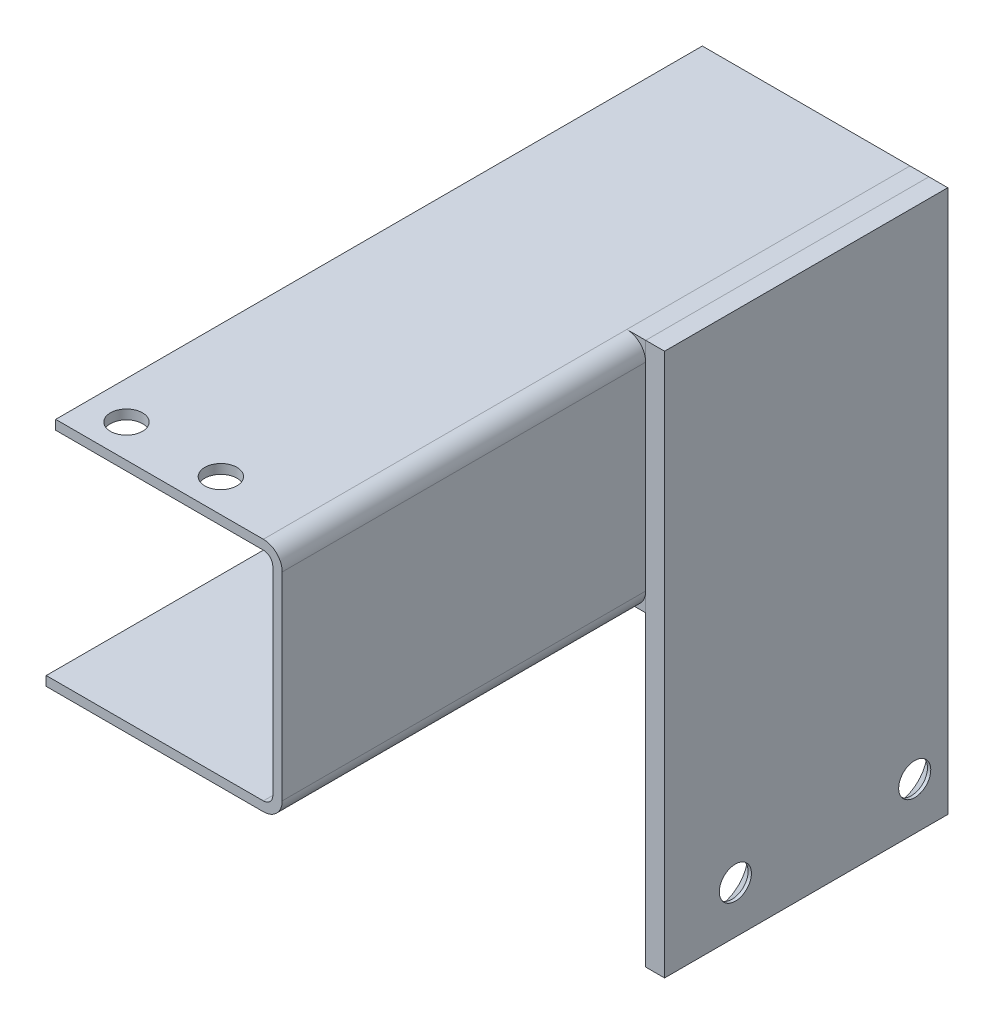
ISO-10303-21;
HEADER;
FILE_DESCRIPTION(('STEP AP214'),'2;1');
FILE_NAME('part.step','',(''),(''),'','','');
FILE_SCHEMA(('AUTOMOTIVE_DESIGN { 1 0 10303 214 1 1 1 1 }'));
ENDSEC;
DATA;
#1=APPLICATION_CONTEXT('core data for automotive mechanical design processes');
#2=APPLICATION_PROTOCOL_DEFINITION('international standard','automotive_design',2000,#1);
#3=PRODUCT_CONTEXT('',#1,'mechanical');
#4=PRODUCT('Part','Part','',(#3));
#5=PRODUCT_RELATED_PRODUCT_CATEGORY('part','',(#4));
#6=PRODUCT_DEFINITION_FORMATION('','',#4);
#7=PRODUCT_DEFINITION_CONTEXT('part definition',#1,'design');
#8=PRODUCT_DEFINITION('design','',#6,#7);
#9=PRODUCT_DEFINITION_SHAPE('','',#8);
#10=(LENGTH_UNIT() NAMED_UNIT(*) SI_UNIT(.MILLI.,.METRE.));
#11=(NAMED_UNIT(*) PLANE_ANGLE_UNIT() SI_UNIT($,.RADIAN.));
#12=(NAMED_UNIT(*) SI_UNIT($,.STERADIAN.) SOLID_ANGLE_UNIT());
#13=UNCERTAINTY_MEASURE_WITH_UNIT(LENGTH_MEASURE(1.E-05),#10,'distance_accuracy_value','');
#14=(GEOMETRIC_REPRESENTATION_CONTEXT(3) GLOBAL_UNCERTAINTY_ASSIGNED_CONTEXT((#13)) GLOBAL_UNIT_ASSIGNED_CONTEXT((#10,
#11,#12)) REPRESENTATION_CONTEXT('',''));
#15=CARTESIAN_POINT('',(0.,0.,0.));
#16=DIRECTION('',(0.,0.,1.));
#17=DIRECTION('',(1.,0.,0.));
#18=AXIS2_PLACEMENT_3D('',#15,#16,#17);
#19=CARTESIAN_POINT('',(-2.00000000000003,-12.5,-35.6715728752538));
#20=DIRECTION('',(0.,-1.,0.));
#21=DIRECTION('',(0.,0.,-1.));
#22=AXIS2_PLACEMENT_3D('',#19,#20,#21);
#23=PLANE('',#22);
#24=DIRECTION('',(1.,0.,0.));
#25=VECTOR('',#24,1.);
#26=CARTESIAN_POINT('',(-1.99999999999999,-12.5,-68.5));
#27=LINE('',#26,#25);
#28=CARTESIAN_POINT('',(0.,-12.5,-68.5));
#29=VERTEX_POINT('',#28);
#30=CARTESIAN_POINT('',(-2.00000000000001,-12.5,-68.5));
#31=VERTEX_POINT('',#30);
#32=EDGE_CURVE('P0_E47',#29,#31,#27,.F.);
#33=ORIENTED_EDGE('',*,*,#32,.F.);
#34=DIRECTION('',(0.,0.,-1.));
#35=VECTOR('',#34,1.);
#36=CARTESIAN_POINT('',(0.,-12.5,-35.6715728752538));
#37=LINE('',#36,#35);
#38=CARTESIAN_POINT('',(0.,-12.5,-38.5));
#39=VERTEX_POINT('',#38);
#40=EDGE_CURVE('P0_E54',#39,#29,#37,.T.);
#41=ORIENTED_EDGE('',*,*,#40,.F.);
#42=DIRECTION('',(1.,0.,0.));
#43=VECTOR('',#42,1.);
#44=CARTESIAN_POINT('',(2.,-12.5,-38.5));
#45=LINE('',#44,#43);
#46=CARTESIAN_POINT('',(-2.00000000000001,-12.5,-38.5));
#47=VERTEX_POINT('',#46);
#48=EDGE_CURVE('P0_E62',#39,#47,#45,.F.);
#49=ORIENTED_EDGE('',*,*,#48,.T.);
#50=DIRECTION('',(0.,0.,-1.));
#51=VECTOR('',#50,1.);
#52=CARTESIAN_POINT('',(-2.00000000000003,-12.5,-35.6715728752538));
#53=LINE('',#52,#51);
#54=EDGE_CURVE('P0_E59',#47,#31,#53,.T.);
#55=ORIENTED_EDGE('',*,*,#54,.T.);
#56=EDGE_LOOP('',(#33,#41,#49,#55));
#57=FACE_BOUND('',#56,.T.);
#58=ADVANCED_FACE('P0_F16',(#57),#23,.T.);
#59=CARTESIAN_POINT('',(-1.99999999999999,-10.5,-68.5));
#60=DIRECTION('',(0.,0.,-1.));
#61=DIRECTION('',(0.,1.,0.));
#62=AXIS2_PLACEMENT_3D('',#59,#60,#61);
#63=PLANE('',#62);
#64=DIRECTION('',(0.,1.,0.));
#65=VECTOR('',#64,1.);
#66=CARTESIAN_POINT('',(0.,-10.5,-68.5));
#67=LINE('',#66,#65);
#68=CARTESIAN_POINT('',(0.,-10.5,-68.5));
#69=VERTEX_POINT('',#68);
#70=EDGE_CURVE('P0_E50',#29,#69,#67,.T.);
#71=ORIENTED_EDGE('',*,*,#70,.F.);
#72=ORIENTED_EDGE('',*,*,#32,.T.);
#73=CARTESIAN_POINT('',(-1.99999999999999,-10.5,-68.5));
#74=DIRECTION('',(0.,0.,-1.));
#75=DIRECTION('',(0.,1.,0.));
#76=AXIS2_PLACEMENT_3D('',#73,#74,#75);
#77=CIRCLE('',#76,1.99999999999999);
#78=EDGE_CURVE('P0_E19',#31,#69,#77,.F.);
#79=ORIENTED_EDGE('',*,*,#78,.T.);
#80=EDGE_LOOP('',(#71,#72,#79));
#81=FACE_BOUND('',#80,.T.);
#82=ADVANCED_FACE('P0_F49',(#81),#63,.T.);
#83=CARTESIAN_POINT('',(0.,-10.5,-35.6715728752538));
#84=DIRECTION('',(1.,0.,0.));
#85=DIRECTION('',(0.,0.,-1.));
#86=AXIS2_PLACEMENT_3D('',#83,#84,#85);
#87=PLANE('',#86);
#88=ORIENTED_EDGE('',*,*,#70,.T.);
#89=DIRECTION('',(0.,0.,-1.));
#90=VECTOR('',#89,1.);
#91=CARTESIAN_POINT('',(0.,-10.5,-35.6715728752538));
#92=LINE('',#91,#90);
#93=CARTESIAN_POINT('',(0.,-10.5,-38.5));
#94=VERTEX_POINT('',#93);
#95=EDGE_CURVE('P0_E25',#69,#94,#92,.F.);
#96=ORIENTED_EDGE('',*,*,#95,.T.);
#97=DIRECTION('',(0.,1.,0.));
#98=VECTOR('',#97,1.);
#99=CARTESIAN_POINT('',(0.,12.5,-38.5));
#100=LINE('',#99,#98);
#101=EDGE_CURVE('P0_E31',#94,#39,#100,.F.);
#102=ORIENTED_EDGE('',*,*,#101,.T.);
#103=ORIENTED_EDGE('',*,*,#40,.T.);
#104=EDGE_LOOP('',(#88,#96,#102,#103));
#105=FACE_BOUND('',#104,.T.);
#106=ADVANCED_FACE('P0_F77',(#105),#87,.T.);
#107=CARTESIAN_POINT('',(2.,12.5,-38.5));
#108=DIRECTION('',(0.,0.,-1.));
#109=DIRECTION('',(0.,1.,0.));
#110=AXIS2_PLACEMENT_3D('',#107,#108,#109);
#111=PLANE('',#110);
#112=ORIENTED_EDGE('',*,*,#48,.F.);
#113=ORIENTED_EDGE('',*,*,#101,.F.);
#114=CARTESIAN_POINT('',(-1.99999999999999,-10.5,-38.5));
#115=DIRECTION('',(0.,0.,-1.));
#116=DIRECTION('',(0.,1.,0.));
#117=AXIS2_PLACEMENT_3D('',#114,#115,#116);
#118=CIRCLE('',#117,1.99999999999999);
#119=EDGE_CURVE('P0_E11',#94,#47,#118,.T.);
#120=ORIENTED_EDGE('',*,*,#119,.T.);
#121=EDGE_LOOP('',(#112,#113,#120));
#122=FACE_BOUND('',#121,.T.);
#123=ADVANCED_FACE('P0_F78',(#122),#111,.F.);
#124=CARTESIAN_POINT('',(-1.99999999999999,-10.5,-35.6715728752538));
#125=DIRECTION('',(0.,0.,-1.));
#126=DIRECTION('',(0.,1.,0.));
#127=AXIS2_PLACEMENT_3D('',#124,#125,#126);
#128=CYLINDRICAL_SURFACE('',#127,1.99999999999999);
#129=ORIENTED_EDGE('',*,*,#95,.F.);
#130=ORIENTED_EDGE('',*,*,#78,.F.);
#131=ORIENTED_EDGE('',*,*,#54,.F.);
#132=ORIENTED_EDGE('',*,*,#119,.F.);
#133=EDGE_LOOP('',(#129,#130,#131,#132));
#134=FACE_BOUND('',#133,.T.);
#135=ADVANCED_FACE('P0_F58',(#134),#128,.F.);
#136=CLOSED_SHELL('',(#58,#82,#106,#123,#135));
#137=MANIFOLD_SOLID_BREP('P0_B1',#136);
#138=CARTESIAN_POINT('',(-2.,10.5,-68.5));
#139=DIRECTION('',(0.,0.,-1.));
#140=DIRECTION('',(-1.,0.,0.));
#141=AXIS2_PLACEMENT_3D('',#138,#139,#140);
#142=CYLINDRICAL_SURFACE('',#141,1.);
#143=DIRECTION('',(0.,0.,1.));
#144=VECTOR('',#143,1.);
#145=CARTESIAN_POINT('',(-1.,10.5,-68.5));
#146=LINE('',#145,#144);
#147=CARTESIAN_POINT('',(-0.999999999999997,10.5,0.));
#148=VERTEX_POINT('',#147);
#149=CARTESIAN_POINT('',(-1.,10.5,-68.5));
#150=VERTEX_POINT('',#149);
#151=EDGE_CURVE('P1_E116',#148,#150,#146,.F.);
#152=ORIENTED_EDGE('',*,*,#151,.F.);
#153=CARTESIAN_POINT('',(-2.,10.5,0.));
#154=DIRECTION('',(0.,0.,-1.));
#155=DIRECTION('',(-1.,0.,0.));
#156=AXIS2_PLACEMENT_3D('',#153,#154,#155);
#157=CIRCLE('',#156,1.);
#158=CARTESIAN_POINT('',(-2.,11.5,0.));
#159=VERTEX_POINT('',#158);
#160=EDGE_CURVE('P1_E19',#159,#148,#157,.T.);
#161=ORIENTED_EDGE('',*,*,#160,.F.);
#162=DIRECTION('',(0.,0.,1.));
#163=VECTOR('',#162,1.);
#164=CARTESIAN_POINT('',(-2.,11.5,-68.5));
#165=LINE('',#164,#163);
#166=CARTESIAN_POINT('',(-2.,11.5,-68.5));
#167=VERTEX_POINT('',#166);
#168=EDGE_CURVE('P1_E175',#167,#159,#165,.T.);
#169=ORIENTED_EDGE('',*,*,#168,.F.);
#170=CARTESIAN_POINT('',(-2.,10.5,-68.5));
#171=DIRECTION('',(0.,0.,-1.));
#172=DIRECTION('',(-1.,0.,0.));
#173=AXIS2_PLACEMENT_3D('',#170,#171,#172);
#174=CIRCLE('',#173,1.);
#175=EDGE_CURVE('P1_E114',#150,#167,#174,.F.);
#176=ORIENTED_EDGE('',*,*,#175,.F.);
#177=EDGE_LOOP('',(#152,#161,#169,#176));
#178=FACE_BOUND('',#177,.T.);
#179=ADVANCED_FACE('P1_F16',(#178),#142,.F.);
#180=CARTESIAN_POINT('',(-20.,12.5,-3.5));
#181=DIRECTION('',(0.,1.,0.));
#182=DIRECTION('',(-1.,0.,0.));
#183=AXIS2_PLACEMENT_3D('',#180,#181,#182);
#184=CYLINDRICAL_SURFACE('',#183,1.7);
#185=CARTESIAN_POINT('',(-20.,12.5,-3.5));
#186=DIRECTION('',(0.,1.,0.));
#187=DIRECTION('',(-1.,0.,0.));
#188=AXIS2_PLACEMENT_3D('',#185,#186,#187);
#189=CIRCLE('',#188,1.7);
#190=CARTESIAN_POINT('',(-21.7,12.5,-3.5));
#191=VERTEX_POINT('',#190);
#192=EDGE_CURVE('P1_E169',#191,#191,#189,.F.);
#193=ORIENTED_EDGE('',*,*,#192,.F.);
#194=EDGE_LOOP('',(#193));
#195=FACE_BOUND('',#194,.T.);
#196=CARTESIAN_POINT('',(-20.,11.5,-3.5));
#197=DIRECTION('',(0.,1.,0.));
#198=DIRECTION('',(-1.,0.,0.));
#199=AXIS2_PLACEMENT_3D('',#196,#197,#198);
#200=CIRCLE('',#199,1.7);
#201=CARTESIAN_POINT('',(-21.7,11.5,-3.5));
#202=VERTEX_POINT('',#201);
#203=EDGE_CURVE('P1_E184',#202,#202,#200,.T.);
#204=ORIENTED_EDGE('',*,*,#203,.F.);
#205=EDGE_LOOP('',(#204));
#206=FACE_BOUND('',#205,.T.);
#207=ADVANCED_FACE('P1_F288',(#195,#206),#184,.F.);
#208=CARTESIAN_POINT('',(-10.,12.5,-3.5));
#209=DIRECTION('',(0.,1.,0.));
#210=DIRECTION('',(-1.,0.,0.));
#211=AXIS2_PLACEMENT_3D('',#208,#209,#210);
#212=CYLINDRICAL_SURFACE('',#211,1.7);
#213=CARTESIAN_POINT('',(-10.,12.5,-3.5));
#214=DIRECTION('',(0.,1.,0.));
#215=DIRECTION('',(-1.,0.,0.));
#216=AXIS2_PLACEMENT_3D('',#213,#214,#215);
#217=CIRCLE('',#216,1.7);
#218=CARTESIAN_POINT('',(-11.7,12.5,-3.5));
#219=VERTEX_POINT('',#218);
#220=EDGE_CURVE('P1_E161',#219,#219,#217,.F.);
#221=ORIENTED_EDGE('',*,*,#220,.F.);
#222=EDGE_LOOP('',(#221));
#223=FACE_BOUND('',#222,.T.);
#224=CARTESIAN_POINT('',(-10.,11.5,-3.5));
#225=DIRECTION('',(0.,1.,0.));
#226=DIRECTION('',(-1.,0.,0.));
#227=AXIS2_PLACEMENT_3D('',#224,#225,#226);
#228=CIRCLE('',#227,1.7);
#229=CARTESIAN_POINT('',(-11.7,11.5,-3.5));
#230=VERTEX_POINT('',#229);
#231=EDGE_CURVE('P1_E177',#230,#230,#228,.T.);
#232=ORIENTED_EDGE('',*,*,#231,.F.);
#233=EDGE_LOOP('',(#232));
#234=FACE_BOUND('',#233,.T.);
#235=ADVANCED_FACE('P1_F280',(#223,#234),#212,.F.);
#236=CARTESIAN_POINT('',(-24.,12.5,-68.5));
#237=DIRECTION('',(-1.,0.,0.));
#238=DIRECTION('',(0.,-1.,0.));
#239=AXIS2_PLACEMENT_3D('',#236,#237,#238);
#240=PLANE('',#239);
#241=DIRECTION('',(0.,-1.,0.));
#242=VECTOR('',#241,1.);
#243=CARTESIAN_POINT('',(-24.,12.5,-68.5));
#244=LINE('',#243,#242);
#245=CARTESIAN_POINT('',(-24.,12.5,-68.5));
#246=VERTEX_POINT('',#245);
#247=CARTESIAN_POINT('',(-24.,11.5,-68.5));
#248=VERTEX_POINT('',#247);
#249=EDGE_CURVE('P1_E182',#246,#248,#244,.T.);
#250=ORIENTED_EDGE('',*,*,#249,.T.);
#251=DIRECTION('',(0.,0.,1.));
#252=VECTOR('',#251,1.);
#253=CARTESIAN_POINT('',(-24.,11.5,-68.5));
#254=LINE('',#253,#252);
#255=CARTESIAN_POINT('',(-24.,11.5,0.));
#256=VERTEX_POINT('',#255);
#257=EDGE_CURVE('P1_E120',#256,#248,#254,.F.);
#258=ORIENTED_EDGE('',*,*,#257,.F.);
#259=DIRECTION('',(0.,-1.,0.));
#260=VECTOR('',#259,1.);
#261=CARTESIAN_POINT('',(-24.,12.5,0.));
#262=LINE('',#261,#260);
#263=CARTESIAN_POINT('',(-24.,12.5,0.));
#264=VERTEX_POINT('',#263);
#265=EDGE_CURVE('P1_E185',#256,#264,#262,.F.);
#266=ORIENTED_EDGE('',*,*,#265,.T.);
#267=DIRECTION('',(0.,0.,1.));
#268=VECTOR('',#267,1.);
#269=CARTESIAN_POINT('',(-24.,12.5,-68.5));
#270=LINE('',#269,#268);
#271=EDGE_CURVE('P1_E160',#246,#264,#270,.T.);
#272=ORIENTED_EDGE('',*,*,#271,.F.);
#273=EDGE_LOOP('',(#250,#258,#266,#272));
#274=FACE_BOUND('',#273,.T.);
#275=ADVANCED_FACE('P1_F272',(#274),#240,.T.);
#276=CARTESIAN_POINT('',(-24.,11.5,-68.5));
#277=DIRECTION('',(0.,-1.,0.));
#278=DIRECTION('',(1.,0.,0.));
#279=AXIS2_PLACEMENT_3D('',#276,#277,#278);
#280=PLANE('',#279);
#281=DIRECTION('',(1.,0.,0.));
#282=VECTOR('',#281,1.);
#283=CARTESIAN_POINT('',(-25.,11.5,0.));
#284=LINE('',#283,#282);
#285=EDGE_CURVE('P1_E113',#256,#159,#284,.T.);
#286=ORIENTED_EDGE('',*,*,#285,.F.);
#287=ORIENTED_EDGE('',*,*,#257,.T.);
#288=DIRECTION('',(1.,0.,0.));
#289=VECTOR('',#288,1.);
#290=CARTESIAN_POINT('',(-25.,11.5,-68.5));
#291=LINE('',#290,#289);
#292=EDGE_CURVE('P1_E201',#248,#167,#291,.T.);
#293=ORIENTED_EDGE('',*,*,#292,.T.);
#294=ORIENTED_EDGE('',*,*,#168,.T.);
#295=EDGE_LOOP('',(#286,#287,#293,#294));
#296=FACE_BOUND('',#295,.T.);
#297=ORIENTED_EDGE('',*,*,#231,.T.);
#298=EDGE_LOOP('',(#297));
#299=FACE_BOUND('',#298,.T.);
#300=ORIENTED_EDGE('',*,*,#203,.T.);
#301=EDGE_LOOP('',(#300));
#302=FACE_BOUND('',#301,.T.);
#303=ADVANCED_FACE('P1_F219',(#296,#299,#302),#280,.T.);
#304=CARTESIAN_POINT('',(-1.,11.5,-68.5));
#305=DIRECTION('',(-1.,0.,0.));
#306=DIRECTION('',(0.,-1.,0.));
#307=AXIS2_PLACEMENT_3D('',#304,#305,#306);
#308=PLANE('',#307);
#309=DIRECTION('',(0.,1.,0.));
#310=VECTOR('',#309,1.);
#311=CARTESIAN_POINT('',(-1.,-12.5,-68.5));
#312=LINE('',#311,#310);
#313=CARTESIAN_POINT('',(-1.,-10.5,-68.5));
#314=VERTEX_POINT('',#313);
#315=EDGE_CURVE('P1_E199',#150,#314,#312,.F.);
#316=ORIENTED_EDGE('',*,*,#315,.T.);
#317=DIRECTION('',(0.,0.,-1.));
#318=VECTOR('',#317,1.);
#319=CARTESIAN_POINT('',(-1.,-10.5,-68.5));
#320=LINE('',#319,#318);
#321=CARTESIAN_POINT('',(-0.999999999999998,-10.5,0.));
#322=VERTEX_POINT('',#321);
#323=EDGE_CURVE('P1_E124',#314,#322,#320,.F.);
#324=ORIENTED_EDGE('',*,*,#323,.T.);
#325=DIRECTION('',(0.,1.,0.));
#326=VECTOR('',#325,1.);
#327=CARTESIAN_POINT('',(-0.999999999999994,-12.5,0.));
#328=LINE('',#327,#326);
#329=EDGE_CURVE('P1_E110',#148,#322,#328,.F.);
#330=ORIENTED_EDGE('',*,*,#329,.F.);
#331=ORIENTED_EDGE('',*,*,#151,.T.);
#332=EDGE_LOOP('',(#316,#324,#330,#331));
#333=FACE_BOUND('',#332,.T.);
#334=ADVANCED_FACE('P1_F122',(#333),#308,.T.);
#335=CARTESIAN_POINT('',(-2.00000000000001,-10.5,-68.5));
#336=DIRECTION('',(0.,0.,1.));
#337=DIRECTION('',(1.,0.,0.));
#338=AXIS2_PLACEMENT_3D('',#335,#336,#337);
#339=CYLINDRICAL_SURFACE('',#338,2.);
#340=CARTESIAN_POINT('',(-2.00000000000001,-10.5,0.));
#341=DIRECTION('',(0.,0.,1.));
#342=DIRECTION('',(1.,0.,0.));
#343=AXIS2_PLACEMENT_3D('',#340,#341,#342);
#344=CIRCLE('',#343,2.);
#345=CARTESIAN_POINT('',(-2.00000000000001,-12.5,0.));
#346=VERTEX_POINT('',#345);
#347=CARTESIAN_POINT('',(0.,-10.5,0.));
#348=VERTEX_POINT('',#347);
#349=EDGE_CURVE('P1_E127',#346,#348,#344,.T.);
#350=ORIENTED_EDGE('',*,*,#349,.F.);
#351=DIRECTION('',(0.,0.,1.));
#352=VECTOR('',#351,1.);
#353=CARTESIAN_POINT('',(-2.00000000000001,-12.5,-68.5));
#354=LINE('',#353,#352);
#355=CARTESIAN_POINT('',(-2.00000000000001,-12.5,-68.5));
#356=VERTEX_POINT('',#355);
#357=EDGE_CURVE('P1_E144',#356,#346,#354,.T.);
#358=ORIENTED_EDGE('',*,*,#357,.F.);
#359=CARTESIAN_POINT('',(-2.00000000000001,-10.5,-68.5));
#360=DIRECTION('',(0.,0.,1.));
#361=DIRECTION('',(1.,0.,0.));
#362=AXIS2_PLACEMENT_3D('',#359,#360,#361);
#363=CIRCLE('',#362,2.);
#364=CARTESIAN_POINT('',(0.,-10.5,-68.5));
#365=VERTEX_POINT('',#364);
#366=EDGE_CURVE('P1_E194',#356,#365,#363,.T.);
#367=ORIENTED_EDGE('',*,*,#366,.T.);
#368=DIRECTION('',(0.,0.,1.));
#369=VECTOR('',#368,1.);
#370=CARTESIAN_POINT('',(0.,-10.5,-68.5));
#371=LINE('',#370,#369);
#372=EDGE_CURVE('P1_E119',#348,#365,#371,.F.);
#373=ORIENTED_EDGE('',*,*,#372,.F.);
#374=EDGE_LOOP('',(#350,#358,#367,#373));
#375=FACE_BOUND('',#374,.T.);
#376=ADVANCED_FACE('P1_F257',(#375),#339,.T.);
#377=CARTESIAN_POINT('',(0.,-12.5,-68.5));
#378=DIRECTION('',(1.,0.,0.));
#379=DIRECTION('',(0.,1.,0.));
#380=AXIS2_PLACEMENT_3D('',#377,#378,#379);
#381=PLANE('',#380);
#382=DIRECTION('',(0.,1.,0.));
#383=VECTOR('',#382,1.);
#384=CARTESIAN_POINT('',(0.,-12.5,0.));
#385=LINE('',#384,#383);
#386=CARTESIAN_POINT('',(0.,10.5,0.));
#387=VERTEX_POINT('',#386);
#388=EDGE_CURVE('P1_E141',#348,#387,#385,.T.);
#389=ORIENTED_EDGE('',*,*,#388,.F.);
#390=ORIENTED_EDGE('',*,*,#372,.T.);
#391=DIRECTION('',(0.,1.,0.));
#392=VECTOR('',#391,1.);
#393=CARTESIAN_POINT('',(0.,-12.5,-68.5));
#394=LINE('',#393,#392);
#395=CARTESIAN_POINT('',(0.,10.5,-68.5));
#396=VERTEX_POINT('',#395);
#397=EDGE_CURVE('P1_E193',#365,#396,#394,.T.);
#398=ORIENTED_EDGE('',*,*,#397,.T.);
#399=DIRECTION('',(0.,0.,1.));
#400=VECTOR('',#399,1.);
#401=CARTESIAN_POINT('',(0.,10.5,-68.5));
#402=LINE('',#401,#400);
#403=EDGE_CURVE('P1_E166',#387,#396,#402,.F.);
#404=ORIENTED_EDGE('',*,*,#403,.F.);
#405=EDGE_LOOP('',(#389,#390,#398,#404));
#406=FACE_BOUND('',#405,.T.);
#407=ADVANCED_FACE('P1_F260',(#406),#381,.T.);
#408=CARTESIAN_POINT('',(-2.,10.5,-68.5));
#409=DIRECTION('',(0.,0.,1.));
#410=DIRECTION('',(1.,0.,0.));
#411=AXIS2_PLACEMENT_3D('',#408,#409,#410);
#412=CYLINDRICAL_SURFACE('',#411,2.);
#413=CARTESIAN_POINT('',(-2.,10.5,0.));
#414=DIRECTION('',(0.,0.,1.));
#415=DIRECTION('',(1.,0.,0.));
#416=AXIS2_PLACEMENT_3D('',#413,#414,#415);
#417=CIRCLE('',#416,2.);
#418=CARTESIAN_POINT('',(-2.,12.5,0.));
#419=VERTEX_POINT('',#418);
#420=EDGE_CURVE('P1_E138',#387,#419,#417,.T.);
#421=ORIENTED_EDGE('',*,*,#420,.F.);
#422=ORIENTED_EDGE('',*,*,#403,.T.);
#423=CARTESIAN_POINT('',(-2.,10.5,-68.5));
#424=DIRECTION('',(0.,0.,1.));
#425=DIRECTION('',(1.,0.,0.));
#426=AXIS2_PLACEMENT_3D('',#423,#424,#425);
#427=CIRCLE('',#426,2.);
#428=CARTESIAN_POINT('',(-2.,12.5,-68.5));
#429=VERTEX_POINT('',#428);
#430=EDGE_CURVE('P1_E191',#396,#429,#427,.T.);
#431=ORIENTED_EDGE('',*,*,#430,.T.);
#432=DIRECTION('',(0.,0.,1.));
#433=VECTOR('',#432,1.);
#434=CARTESIAN_POINT('',(-1.99999999999999,12.5,-68.5));
#435=LINE('',#434,#433);
#436=EDGE_CURVE('P1_E157',#419,#429,#435,.F.);
#437=ORIENTED_EDGE('',*,*,#436,.F.);
#438=EDGE_LOOP('',(#421,#422,#431,#437));
#439=FACE_BOUND('',#438,.T.);
#440=ADVANCED_FACE('P1_F263',(#439),#412,.T.);
#441=CARTESIAN_POINT('',(0.,12.5,-68.5));
#442=DIRECTION('',(0.,1.,0.));
#443=DIRECTION('',(-1.,0.,0.));
#444=AXIS2_PLACEMENT_3D('',#441,#442,#443);
#445=PLANE('',#444);
#446=DIRECTION('',(1.,0.,0.));
#447=VECTOR('',#446,1.);
#448=CARTESIAN_POINT('',(-25.,12.5,-68.5));
#449=LINE('',#448,#447);
#450=EDGE_CURVE('P1_E148',#429,#246,#449,.F.);
#451=ORIENTED_EDGE('',*,*,#450,.T.);
#452=ORIENTED_EDGE('',*,*,#271,.T.);
#453=DIRECTION('',(1.,0.,0.));
#454=VECTOR('',#453,1.);
#455=CARTESIAN_POINT('',(-25.,12.5,0.));
#456=LINE('',#455,#454);
#457=EDGE_CURVE('P1_E129',#419,#264,#456,.F.);
#458=ORIENTED_EDGE('',*,*,#457,.F.);
#459=ORIENTED_EDGE('',*,*,#436,.T.);
#460=EDGE_LOOP('',(#451,#452,#458,#459));
#461=FACE_BOUND('',#460,.T.);
#462=ORIENTED_EDGE('',*,*,#220,.T.);
#463=EDGE_LOOP('',(#462));
#464=FACE_BOUND('',#463,.T.);
#465=ORIENTED_EDGE('',*,*,#192,.T.);
#466=EDGE_LOOP('',(#465));
#467=FACE_BOUND('',#466,.T.);
#468=ADVANCED_FACE('P1_F267',(#461,#464,#467),#445,.T.);
#469=CARTESIAN_POINT('',(-25.,-12.5,-68.5));
#470=DIRECTION('',(0.,-1.,0.));
#471=DIRECTION('',(1.,0.,0.));
#472=AXIS2_PLACEMENT_3D('',#469,#470,#471);
#473=PLANE('',#472);
#474=DIRECTION('',(1.,0.,0.));
#475=VECTOR('',#474,1.);
#476=CARTESIAN_POINT('',(-25.,-12.5,0.));
#477=LINE('',#476,#475);
#478=CARTESIAN_POINT('',(-25.,-12.5,0.));
#479=VERTEX_POINT('',#478);
#480=EDGE_CURVE('P1_E125',#479,#346,#477,.T.);
#481=ORIENTED_EDGE('',*,*,#480,.F.);
#482=DIRECTION('',(0.,0.,1.));
#483=VECTOR('',#482,1.);
#484=CARTESIAN_POINT('',(-25.,-12.5,-68.5));
#485=LINE('',#484,#483);
#486=CARTESIAN_POINT('',(-25.,-12.5,-68.5));
#487=VERTEX_POINT('',#486);
#488=EDGE_CURVE('P1_E151',#487,#479,#485,.T.);
#489=ORIENTED_EDGE('',*,*,#488,.F.);
#490=DIRECTION('',(1.,0.,0.));
#491=VECTOR('',#490,1.);
#492=CARTESIAN_POINT('',(-25.,-12.5,-68.5));
#493=LINE('',#492,#491);
#494=EDGE_CURVE('P1_E196',#487,#356,#493,.T.);
#495=ORIENTED_EDGE('',*,*,#494,.T.);
#496=ORIENTED_EDGE('',*,*,#357,.T.);
#497=EDGE_LOOP('',(#481,#489,#495,#496));
#498=FACE_BOUND('',#497,.T.);
#499=ADVANCED_FACE('P1_F252',(#498),#473,.T.);
#500=CARTESIAN_POINT('',(-25.,-12.5,0.));
#501=DIRECTION('',(0.,0.,1.));
#502=DIRECTION('',(1.,0.,0.));
#503=AXIS2_PLACEMENT_3D('',#500,#501,#502);
#504=PLANE('',#503);
#505=ORIENTED_EDGE('',*,*,#480,.T.);
#506=ORIENTED_EDGE('',*,*,#349,.T.);
#507=ORIENTED_EDGE('',*,*,#388,.T.);
#508=ORIENTED_EDGE('',*,*,#420,.T.);
#509=ORIENTED_EDGE('',*,*,#457,.T.);
#510=ORIENTED_EDGE('',*,*,#265,.F.);
#511=ORIENTED_EDGE('',*,*,#285,.T.);
#512=ORIENTED_EDGE('',*,*,#160,.T.);
#513=ORIENTED_EDGE('',*,*,#329,.T.);
#514=CARTESIAN_POINT('',(-2.,-10.5,0.));
#515=DIRECTION('',(0.,0.,-1.));
#516=DIRECTION('',(-1.,0.,0.));
#517=AXIS2_PLACEMENT_3D('',#514,#515,#516);
#518=CIRCLE('',#517,1.);
#519=CARTESIAN_POINT('',(-2.,-11.5,0.));
#520=VERTEX_POINT('',#519);
#521=EDGE_CURVE('P1_E173',#322,#520,#518,.T.);
#522=ORIENTED_EDGE('',*,*,#521,.T.);
#523=DIRECTION('',(-1.,0.,0.));
#524=VECTOR('',#523,1.);
#525=CARTESIAN_POINT('',(-1.,-11.5,0.));
#526=LINE('',#525,#524);
#527=CARTESIAN_POINT('',(-25.,-11.5,0.));
#528=VERTEX_POINT('',#527);
#529=EDGE_CURVE('P1_E154',#528,#520,#526,.F.);
#530=ORIENTED_EDGE('',*,*,#529,.F.);
#531=DIRECTION('',(0.,-1.,0.));
#532=VECTOR('',#531,1.);
#533=CARTESIAN_POINT('',(-25.,-11.5,0.));
#534=LINE('',#533,#532);
#535=EDGE_CURVE('P1_E145',#479,#528,#534,.F.);
#536=ORIENTED_EDGE('',*,*,#535,.F.);
#537=EDGE_LOOP('',(#505,#506,#507,#508,#509,#510,#511,#512,#513,#522,#530,#536));
#538=FACE_BOUND('',#537,.T.);
#539=ADVANCED_FACE('P1_F108',(#538),#504,.T.);
#540=CARTESIAN_POINT('',(-2.,-10.5,-68.5));
#541=DIRECTION('',(0.,0.,-1.));
#542=DIRECTION('',(-1.,0.,0.));
#543=AXIS2_PLACEMENT_3D('',#540,#541,#542);
#544=CYLINDRICAL_SURFACE('',#543,1.);
#545=DIRECTION('',(0.,0.,1.));
#546=VECTOR('',#545,1.);
#547=CARTESIAN_POINT('',(-1.99999999999999,-11.5,-68.5));
#548=LINE('',#547,#546);
#549=CARTESIAN_POINT('',(-2.,-11.5,-68.5));
#550=VERTEX_POINT('',#549);
#551=EDGE_CURVE('P1_E228',#520,#550,#548,.F.);
#552=ORIENTED_EDGE('',*,*,#551,.F.);
#553=ORIENTED_EDGE('',*,*,#521,.F.);
#554=ORIENTED_EDGE('',*,*,#323,.F.);
#555=CARTESIAN_POINT('',(-2.,-10.5,-68.5));
#556=DIRECTION('',(0.,0.,-1.));
#557=DIRECTION('',(-1.,0.,0.));
#558=AXIS2_PLACEMENT_3D('',#555,#556,#557);
#559=CIRCLE('',#558,1.);
#560=EDGE_CURVE('P1_E197',#314,#550,#559,.T.);
#561=ORIENTED_EDGE('',*,*,#560,.T.);
#562=EDGE_LOOP('',(#552,#553,#554,#561));
#563=FACE_BOUND('',#562,.T.);
#564=ADVANCED_FACE('P1_F300',(#563),#544,.F.);
#565=CARTESIAN_POINT('',(-25.,-12.5,-68.5));
#566=DIRECTION('',(0.,0.,1.));
#567=DIRECTION('',(1.,0.,0.));
#568=AXIS2_PLACEMENT_3D('',#565,#566,#567);
#569=PLANE('',#568);
#570=ORIENTED_EDGE('',*,*,#430,.F.);
#571=ORIENTED_EDGE('',*,*,#397,.F.);
#572=ORIENTED_EDGE('',*,*,#366,.F.);
#573=ORIENTED_EDGE('',*,*,#494,.F.);
#574=DIRECTION('',(0.,-1.,0.));
#575=VECTOR('',#574,1.);
#576=CARTESIAN_POINT('',(-25.,-11.5,-68.5));
#577=LINE('',#576,#575);
#578=CARTESIAN_POINT('',(-25.,-11.5,-68.5));
#579=VERTEX_POINT('',#578);
#580=EDGE_CURVE('P1_E34',#579,#487,#577,.T.);
#581=ORIENTED_EDGE('',*,*,#580,.F.);
#582=DIRECTION('',(-1.,0.,0.));
#583=VECTOR('',#582,1.);
#584=CARTESIAN_POINT('',(-1.,-11.5,-68.5));
#585=LINE('',#584,#583);
#586=EDGE_CURVE('P1_E25',#550,#579,#585,.T.);
#587=ORIENTED_EDGE('',*,*,#586,.F.);
#588=ORIENTED_EDGE('',*,*,#560,.F.);
#589=ORIENTED_EDGE('',*,*,#315,.F.);
#590=ORIENTED_EDGE('',*,*,#175,.T.);
#591=ORIENTED_EDGE('',*,*,#292,.F.);
#592=ORIENTED_EDGE('',*,*,#249,.F.);
#593=ORIENTED_EDGE('',*,*,#450,.F.);
#594=EDGE_LOOP('',(#570,#571,#572,#573,#581,#587,#588,#589,#590,#591,#592,#593));
#595=FACE_BOUND('',#594,.T.);
#596=ADVANCED_FACE('P1_F215',(#595),#569,.F.);
#597=CARTESIAN_POINT('',(-25.,-11.5,-68.5));
#598=DIRECTION('',(-1.,0.,0.));
#599=DIRECTION('',(0.,-1.,0.));
#600=AXIS2_PLACEMENT_3D('',#597,#598,#599);
#601=PLANE('',#600);
#602=ORIENTED_EDGE('',*,*,#580,.T.);
#603=ORIENTED_EDGE('',*,*,#488,.T.);
#604=ORIENTED_EDGE('',*,*,#535,.T.);
#605=DIRECTION('',(0.,0.,1.));
#606=VECTOR('',#605,1.);
#607=CARTESIAN_POINT('',(-25.,-11.5,-68.5));
#608=LINE('',#607,#606);
#609=EDGE_CURVE('P1_E11',#579,#528,#608,.T.);
#610=ORIENTED_EDGE('',*,*,#609,.F.);
#611=EDGE_LOOP('',(#602,#603,#604,#610));
#612=FACE_BOUND('',#611,.T.);
#613=ADVANCED_FACE('P1_F248',(#612),#601,.T.);
#614=CARTESIAN_POINT('',(-1.,-11.5,-68.5));
#615=DIRECTION('',(0.,1.,0.));
#616=DIRECTION('',(-1.,0.,0.));
#617=AXIS2_PLACEMENT_3D('',#614,#615,#616);
#618=PLANE('',#617);
#619=ORIENTED_EDGE('',*,*,#586,.T.);
#620=ORIENTED_EDGE('',*,*,#609,.T.);
#621=ORIENTED_EDGE('',*,*,#529,.T.);
#622=ORIENTED_EDGE('',*,*,#551,.T.);
#623=EDGE_LOOP('',(#619,#620,#621,#622));
#624=FACE_BOUND('',#623,.T.);
#625=ADVANCED_FACE('P1_F244',(#624),#618,.T.);
#626=CLOSED_SHELL('',(#179,#207,#235,#275,#303,#334,#376,#407,#440,#468,#499,#539,#564,#596,
#613,#625));
#627=MANIFOLD_SOLID_BREP('P1_B1',#626);
#628=CARTESIAN_POINT('',(5.6843418860808E-11,-40.,-46.));
#629=DIRECTION('',(-1.,0.,0.));
#630=DIRECTION('',(0.,0.,1.));
#631=AXIS2_PLACEMENT_3D('',#628,#629,#630);
#632=CONICAL_SURFACE('',#631,3.34999999996265,0.785398163397448);
#633=CARTESIAN_POINT('',(1.65,-40.,-46.));
#634=DIRECTION('',(-1.,0.,0.));
#635=DIRECTION('',(0.,-1.,0.));
#636=AXIS2_PLACEMENT_3D('',#633,#634,#635);
#637=CIRCLE('',#636,1.7);
#638=CARTESIAN_POINT('',(1.65,-41.7,-46.));
#639=VERTEX_POINT('',#638);
#640=EDGE_CURVE('P2_E83',#639,#639,#637,.F.);
#641=ORIENTED_EDGE('',*,*,#640,.T.);
#642=EDGE_LOOP('',(#641));
#643=FACE_BOUND('',#642,.T.);
#644=CARTESIAN_POINT('',(5.6843418860808E-11,-40.,-46.));
#645=DIRECTION('',(-1.,0.,0.));
#646=DIRECTION('',(0.,0.,1.));
#647=AXIS2_PLACEMENT_3D('',#644,#645,#646);
#648=CIRCLE('',#647,3.34999999996265);
#649=CARTESIAN_POINT('',(5.6843418860808E-11,-40.,-42.6500000000374));
#650=VERTEX_POINT('',#649);
#651=EDGE_CURVE('P2_E19',#650,#650,#648,.F.);
#652=ORIENTED_EDGE('',*,*,#651,.F.);
#653=EDGE_LOOP('',(#652));
#654=FACE_BOUND('',#653,.T.);
#655=ADVANCED_FACE('P2_F16',(#643,#654),#632,.F.);
#656=CARTESIAN_POINT('',(5.6843418860808E-11,-40.,-65.));
#657=DIRECTION('',(-1.,0.,0.));
#658=DIRECTION('',(0.,0.,1.));
#659=AXIS2_PLACEMENT_3D('',#656,#657,#658);
#660=CONICAL_SURFACE('',#659,3.34999999995719,0.785398163397448);
#661=CARTESIAN_POINT('',(1.65,-40.,-65.));
#662=DIRECTION('',(-1.,0.,0.));
#663=DIRECTION('',(0.,-1.,0.));
#664=AXIS2_PLACEMENT_3D('',#661,#662,#663);
#665=CIRCLE('',#664,1.70000000000001);
#666=CARTESIAN_POINT('',(1.65,-41.7,-65.));
#667=VERTEX_POINT('',#666);
#668=EDGE_CURVE('P2_E66',#667,#667,#665,.F.);
#669=ORIENTED_EDGE('',*,*,#668,.T.);
#670=EDGE_LOOP('',(#669));
#671=FACE_BOUND('',#670,.T.);
#672=CARTESIAN_POINT('',(5.6843418860808E-11,-40.,-65.));
#673=DIRECTION('',(-1.,0.,0.));
#674=DIRECTION('',(0.,0.,1.));
#675=AXIS2_PLACEMENT_3D('',#672,#673,#674);
#676=CIRCLE('',#675,3.34999999995719);
#677=CARTESIAN_POINT('',(5.6843418860808E-11,-40.,-61.6500000000428));
#678=VERTEX_POINT('',#677);
#679=EDGE_CURVE('P2_E86',#678,#678,#676,.F.);
#680=ORIENTED_EDGE('',*,*,#679,.F.);
#681=EDGE_LOOP('',(#680));
#682=FACE_BOUND('',#681,.T.);
#683=ADVANCED_FACE('P2_F99',(#671,#682),#660,.F.);
#684=CARTESIAN_POINT('',(0.,0.,0.));
#685=DIRECTION('',(-1.,0.,0.));
#686=DIRECTION('',(0.,-1.,0.));
#687=AXIS2_PLACEMENT_3D('',#684,#685,#686);
#688=PLANE('',#687);
#689=DIRECTION('',(0.,1.,0.));
#690=VECTOR('',#689,1.);
#691=CARTESIAN_POINT('',(0.,12.5,-38.5));
#692=LINE('',#691,#690);
#693=CARTESIAN_POINT('',(0.,-45.,-38.5));
#694=VERTEX_POINT('',#693);
#695=CARTESIAN_POINT('',(0.,12.5,-38.5));
#696=VERTEX_POINT('',#695);
#697=EDGE_CURVE('P2_E54',#694,#696,#692,.T.);
#698=ORIENTED_EDGE('',*,*,#697,.T.);
#699=DIRECTION('',(0.,0.,-1.));
#700=VECTOR('',#699,1.);
#701=CARTESIAN_POINT('',(0.,12.5,-68.5));
#702=LINE('',#701,#700);
#703=CARTESIAN_POINT('',(0.,12.5,-68.5));
#704=VERTEX_POINT('',#703);
#705=EDGE_CURVE('P2_E207',#696,#704,#702,.T.);
#706=ORIENTED_EDGE('',*,*,#705,.T.);
#707=DIRECTION('',(0.,-1.,0.));
#708=VECTOR('',#707,1.);
#709=CARTESIAN_POINT('',(0.,12.5,-68.5));
#710=LINE('',#709,#708);
#711=CARTESIAN_POINT('',(0.,-45.,-68.5));
#712=VERTEX_POINT('',#711);
#713=EDGE_CURVE('P2_E60',#704,#712,#710,.T.);
#714=ORIENTED_EDGE('',*,*,#713,.T.);
#715=DIRECTION('',(0.,0.,1.));
#716=VECTOR('',#715,1.);
#717=CARTESIAN_POINT('',(0.,-45.,-68.5000000000001));
#718=LINE('',#717,#716);
#719=EDGE_CURVE('P2_E57',#712,#694,#718,.T.);
#720=ORIENTED_EDGE('',*,*,#719,.T.);
#721=EDGE_LOOP('',(#698,#706,#714,#720));
#722=FACE_BOUND('',#721,.T.);
#723=ORIENTED_EDGE('',*,*,#679,.T.);
#724=EDGE_LOOP('',(#723));
#725=FACE_BOUND('',#724,.T.);
#726=ORIENTED_EDGE('',*,*,#651,.T.);
#727=EDGE_LOOP('',(#726));
#728=FACE_BOUND('',#727,.T.);
#729=ADVANCED_FACE('P2_F58',(#722,#725,#728),#688,.T.);
#730=CARTESIAN_POINT('',(0.,-40.,-46.));
#731=DIRECTION('',(-1.,0.,0.));
#732=DIRECTION('',(0.,-1.,0.));
#733=AXIS2_PLACEMENT_3D('',#730,#731,#732);
#734=CYLINDRICAL_SURFACE('',#733,1.7);
#735=CARTESIAN_POINT('',(2.,-40.,-46.));
#736=DIRECTION('',(-1.,0.,0.));
#737=DIRECTION('',(0.,-1.,0.));
#738=AXIS2_PLACEMENT_3D('',#735,#736,#737);
#739=CIRCLE('',#738,1.7);
#740=CARTESIAN_POINT('',(2.,-41.7,-46.));
#741=VERTEX_POINT('',#740);
#742=EDGE_CURVE('P2_E90',#741,#741,#739,.F.);
#743=ORIENTED_EDGE('',*,*,#742,.T.);
#744=EDGE_LOOP('',(#743));
#745=FACE_BOUND('',#744,.T.);
#746=ORIENTED_EDGE('',*,*,#640,.F.);
#747=EDGE_LOOP('',(#746));
#748=FACE_BOUND('',#747,.T.);
#749=ADVANCED_FACE('P2_F129',(#745,#748),#734,.F.);
#750=CARTESIAN_POINT('',(0.,-40.,-65.));
#751=DIRECTION('',(-1.,0.,0.));
#752=DIRECTION('',(0.,-1.,0.));
#753=AXIS2_PLACEMENT_3D('',#750,#751,#752);
#754=CYLINDRICAL_SURFACE('',#753,1.70000000000001);
#755=CARTESIAN_POINT('',(2.,-40.,-65.));
#756=DIRECTION('',(-1.,0.,0.));
#757=DIRECTION('',(0.,-1.,0.));
#758=AXIS2_PLACEMENT_3D('',#755,#756,#757);
#759=CIRCLE('',#758,1.70000000000001);
#760=CARTESIAN_POINT('',(2.,-41.7,-65.));
#761=VERTEX_POINT('',#760);
#762=EDGE_CURVE('P2_E87',#761,#761,#759,.F.);
#763=ORIENTED_EDGE('',*,*,#762,.T.);
#764=EDGE_LOOP('',(#763));
#765=FACE_BOUND('',#764,.T.);
#766=ORIENTED_EDGE('',*,*,#668,.F.);
#767=EDGE_LOOP('',(#766));
#768=FACE_BOUND('',#767,.T.);
#769=ADVANCED_FACE('P2_F126',(#765,#768),#754,.F.);
#770=CARTESIAN_POINT('',(2.,-45.,-68.5000000000001));
#771=DIRECTION('',(0.,1.,0.));
#772=DIRECTION('',(-1.,0.,0.));
#773=AXIS2_PLACEMENT_3D('',#770,#771,#772);
#774=PLANE('',#773);
#775=DIRECTION('',(1.,0.,0.));
#776=VECTOR('',#775,1.);
#777=CARTESIAN_POINT('',(2.,-45.,-68.5));
#778=LINE('',#777,#776);
#779=CARTESIAN_POINT('',(2.,-45.,-68.5));
#780=VERTEX_POINT('',#779);
#781=EDGE_CURVE('P2_E215',#712,#780,#778,.T.);
#782=ORIENTED_EDGE('',*,*,#781,.T.);
#783=DIRECTION('',(0.,0.,1.));
#784=VECTOR('',#783,1.);
#785=CARTESIAN_POINT('',(2.,-45.,0.));
#786=LINE('',#785,#784);
#787=CARTESIAN_POINT('',(2.,-45.,-38.5));
#788=VERTEX_POINT('',#787);
#789=EDGE_CURVE('P2_E77',#780,#788,#786,.T.);
#790=ORIENTED_EDGE('',*,*,#789,.T.);
#791=DIRECTION('',(1.,0.,0.));
#792=VECTOR('',#791,1.);
#793=CARTESIAN_POINT('',(2.,-45.,-38.5));
#794=LINE('',#793,#792);
#795=EDGE_CURVE('P2_E65',#788,#694,#794,.F.);
#796=ORIENTED_EDGE('',*,*,#795,.T.);
#797=ORIENTED_EDGE('',*,*,#719,.F.);
#798=EDGE_LOOP('',(#782,#790,#796,#797));
#799=FACE_BOUND('',#798,.T.);
#800=ADVANCED_FACE('P2_F76',(#799),#774,.F.);
#801=CARTESIAN_POINT('',(2.,12.5,-38.5));
#802=DIRECTION('',(0.,0.,-1.));
#803=DIRECTION('',(0.,1.,0.));
#804=AXIS2_PLACEMENT_3D('',#801,#802,#803);
#805=PLANE('',#804);
#806=ORIENTED_EDGE('',*,*,#795,.F.);
#807=DIRECTION('',(0.,-1.,0.));
#808=VECTOR('',#807,1.);
#809=CARTESIAN_POINT('',(2.,0.,-38.5));
#810=LINE('',#809,#808);
#811=CARTESIAN_POINT('',(2.,12.5,-38.5));
#812=VERTEX_POINT('',#811);
#813=EDGE_CURVE('P2_E208',#788,#812,#810,.F.);
#814=ORIENTED_EDGE('',*,*,#813,.T.);
#815=DIRECTION('',(1.,0.,0.));
#816=VECTOR('',#815,1.);
#817=CARTESIAN_POINT('',(2.,12.5,-38.5));
#818=LINE('',#817,#816);
#819=EDGE_CURVE('P2_E73',#812,#696,#818,.F.);
#820=ORIENTED_EDGE('',*,*,#819,.T.);
#821=ORIENTED_EDGE('',*,*,#697,.F.);
#822=EDGE_LOOP('',(#806,#814,#820,#821));
#823=FACE_BOUND('',#822,.T.);
#824=ADVANCED_FACE('P2_F70',(#823),#805,.F.);
#825=CARTESIAN_POINT('',(2.,12.5,-68.5));
#826=DIRECTION('',(0.,-1.,0.));
#827=DIRECTION('',(0.,0.,-1.));
#828=AXIS2_PLACEMENT_3D('',#825,#826,#827);
#829=PLANE('',#828);
#830=ORIENTED_EDGE('',*,*,#819,.F.);
#831=DIRECTION('',(0.,0.,1.));
#832=VECTOR('',#831,1.);
#833=CARTESIAN_POINT('',(2.,12.5,0.));
#834=LINE('',#833,#832);
#835=CARTESIAN_POINT('',(2.,12.5,-68.5));
#836=VERTEX_POINT('',#835);
#837=EDGE_CURVE('P2_E25',#812,#836,#834,.F.);
#838=ORIENTED_EDGE('',*,*,#837,.T.);
#839=DIRECTION('',(1.,0.,0.));
#840=VECTOR('',#839,1.);
#841=CARTESIAN_POINT('',(2.,12.5,-68.5));
#842=LINE('',#841,#840);
#843=EDGE_CURVE('P2_E33',#836,#704,#842,.F.);
#844=ORIENTED_EDGE('',*,*,#843,.T.);
#845=ORIENTED_EDGE('',*,*,#705,.F.);
#846=EDGE_LOOP('',(#830,#838,#844,#845));
#847=FACE_BOUND('',#846,.T.);
#848=ADVANCED_FACE('P2_F114',(#847),#829,.F.);
#849=CARTESIAN_POINT('',(2.,12.5,-68.5));
#850=DIRECTION('',(0.,0.,1.));
#851=DIRECTION('',(0.,-1.,0.));
#852=AXIS2_PLACEMENT_3D('',#849,#850,#851);
#853=PLANE('',#852);
#854=ORIENTED_EDGE('',*,*,#843,.F.);
#855=DIRECTION('',(0.,-1.,0.));
#856=VECTOR('',#855,1.);
#857=CARTESIAN_POINT('',(2.,0.,-68.5));
#858=LINE('',#857,#856);
#859=EDGE_CURVE('P2_E11',#836,#780,#858,.T.);
#860=ORIENTED_EDGE('',*,*,#859,.T.);
#861=ORIENTED_EDGE('',*,*,#781,.F.);
#862=ORIENTED_EDGE('',*,*,#713,.F.);
#863=EDGE_LOOP('',(#854,#860,#861,#862));
#864=FACE_BOUND('',#863,.T.);
#865=ADVANCED_FACE('P2_F108',(#864),#853,.F.);
#866=CARTESIAN_POINT('',(2.,0.,0.));
#867=DIRECTION('',(-1.,0.,0.));
#868=DIRECTION('',(0.,-1.,0.));
#869=AXIS2_PLACEMENT_3D('',#866,#867,#868);
#870=PLANE('',#869);
#871=ORIENTED_EDGE('',*,*,#837,.F.);
#872=ORIENTED_EDGE('',*,*,#813,.F.);
#873=ORIENTED_EDGE('',*,*,#789,.F.);
#874=ORIENTED_EDGE('',*,*,#859,.F.);
#875=EDGE_LOOP('',(#871,#872,#873,#874));
#876=FACE_BOUND('',#875,.T.);
#877=ORIENTED_EDGE('',*,*,#762,.F.);
#878=EDGE_LOOP('',(#877));
#879=FACE_BOUND('',#878,.T.);
#880=ORIENTED_EDGE('',*,*,#742,.F.);
#881=EDGE_LOOP('',(#880));
#882=FACE_BOUND('',#881,.T.);
#883=ADVANCED_FACE('P2_F106',(#876,#879,#882),#870,.F.);
#884=CLOSED_SHELL('',(#655,#683,#729,#749,#769,#800,#824,#848,#865,#883));
#885=MANIFOLD_SOLID_BREP('P2_B1',#884);
#886=CARTESIAN_POINT('',(0.,12.5,-35.6715728752538));
#887=DIRECTION('',(1.,0.,0.));
#888=DIRECTION('',(0.,0.,-1.));
#889=AXIS2_PLACEMENT_3D('',#886,#887,#888);
#890=PLANE('',#889);
#891=DIRECTION('',(0.,-1.,0.));
#892=VECTOR('',#891,1.);
#893=CARTESIAN_POINT('',(0.,10.5,-68.5));
#894=LINE('',#893,#892);
#895=CARTESIAN_POINT('',(0.,10.5,-68.5));
#896=VERTEX_POINT('',#895);
#897=CARTESIAN_POINT('',(0.,12.5,-68.5));
#898=VERTEX_POINT('',#897);
#899=EDGE_CURVE('P3_E47',#896,#898,#894,.F.);
#900=ORIENTED_EDGE('',*,*,#899,.T.);
#901=DIRECTION('',(0.,0.,1.));
#902=VECTOR('',#901,1.);
#903=CARTESIAN_POINT('',(0.,12.5,-35.6715728752538));
#904=LINE('',#903,#902);
#905=CARTESIAN_POINT('',(0.,12.5,-38.5));
#906=VERTEX_POINT('',#905);
#907=EDGE_CURVE('P3_E54',#906,#898,#904,.F.);
#908=ORIENTED_EDGE('',*,*,#907,.F.);
#909=DIRECTION('',(0.,1.,0.));
#910=VECTOR('',#909,1.);
#911=CARTESIAN_POINT('',(0.,12.5,-38.5));
#912=LINE('',#911,#910);
#913=CARTESIAN_POINT('',(0.,10.5,-38.5));
#914=VERTEX_POINT('',#913);
#915=EDGE_CURVE('P3_E62',#906,#914,#912,.F.);
#916=ORIENTED_EDGE('',*,*,#915,.T.);
#917=DIRECTION('',(0.,0.,-1.));
#918=VECTOR('',#917,1.);
#919=CARTESIAN_POINT('',(0.,10.5,-35.6715728752538));
#920=LINE('',#919,#918);
#921=EDGE_CURVE('P3_E59',#914,#896,#920,.T.);
#922=ORIENTED_EDGE('',*,*,#921,.T.);
#923=EDGE_LOOP('',(#900,#908,#916,#922));
#924=FACE_BOUND('',#923,.T.);
#925=ADVANCED_FACE('P3_F16',(#924),#890,.T.);
#926=CARTESIAN_POINT('',(-2.00000000000001,10.5,-68.5));
#927=DIRECTION('',(0.,0.,1.));
#928=DIRECTION('',(0.,-1.,0.));
#929=AXIS2_PLACEMENT_3D('',#926,#927,#928);
#930=PLANE('',#929);
#931=DIRECTION('',(-1.,0.,0.));
#932=VECTOR('',#931,1.);
#933=CARTESIAN_POINT('',(-1.99999999999999,12.5,-68.5));
#934=LINE('',#933,#932);
#935=CARTESIAN_POINT('',(-2.00000000000001,12.5,-68.5));
#936=VERTEX_POINT('',#935);
#937=EDGE_CURVE('P3_E50',#898,#936,#934,.T.);
#938=ORIENTED_EDGE('',*,*,#937,.F.);
#939=ORIENTED_EDGE('',*,*,#899,.F.);
#940=CARTESIAN_POINT('',(-2.00000000000001,10.5,-68.5));
#941=DIRECTION('',(0.,0.,-1.));
#942=DIRECTION('',(0.,1.,0.));
#943=AXIS2_PLACEMENT_3D('',#940,#941,#942);
#944=CIRCLE('',#943,2.00000000000001);
#945=EDGE_CURVE('P3_E19',#896,#936,#944,.F.);
#946=ORIENTED_EDGE('',*,*,#945,.T.);
#947=EDGE_LOOP('',(#938,#939,#946));
#948=FACE_BOUND('',#947,.T.);
#949=ADVANCED_FACE('P3_F49',(#948),#930,.F.);
#950=CARTESIAN_POINT('',(-1.99999999999999,12.5,-35.6715728752538));
#951=DIRECTION('',(0.,1.,0.));
#952=DIRECTION('',(-1.,0.,0.));
#953=AXIS2_PLACEMENT_3D('',#950,#951,#952);
#954=PLANE('',#953);
#955=ORIENTED_EDGE('',*,*,#937,.T.);
#956=DIRECTION('',(0.,0.,-1.));
#957=VECTOR('',#956,1.);
#958=CARTESIAN_POINT('',(-2.00000000000001,12.5,-35.6715728752538));
#959=LINE('',#958,#957);
#960=CARTESIAN_POINT('',(-2.00000000000001,12.5,-38.5));
#961=VERTEX_POINT('',#960);
#962=EDGE_CURVE('P3_E25',#936,#961,#959,.F.);
#963=ORIENTED_EDGE('',*,*,#962,.T.);
#964=DIRECTION('',(1.,0.,0.));
#965=VECTOR('',#964,1.);
#966=CARTESIAN_POINT('',(2.,12.5,-38.5));
#967=LINE('',#966,#965);
#968=EDGE_CURVE('P3_E31',#961,#906,#967,.T.);
#969=ORIENTED_EDGE('',*,*,#968,.T.);
#970=ORIENTED_EDGE('',*,*,#907,.T.);
#971=EDGE_LOOP('',(#955,#963,#969,#970));
#972=FACE_BOUND('',#971,.T.);
#973=ADVANCED_FACE('P3_F77',(#972),#954,.T.);
#974=CARTESIAN_POINT('',(2.,12.5,-38.5));
#975=DIRECTION('',(0.,0.,-1.));
#976=DIRECTION('',(0.,1.,0.));
#977=AXIS2_PLACEMENT_3D('',#974,#975,#976);
#978=PLANE('',#977);
#979=ORIENTED_EDGE('',*,*,#915,.F.);
#980=ORIENTED_EDGE('',*,*,#968,.F.);
#981=CARTESIAN_POINT('',(-2.00000000000001,10.5,-38.5));
#982=DIRECTION('',(0.,0.,-1.));
#983=DIRECTION('',(0.,1.,0.));
#984=AXIS2_PLACEMENT_3D('',#981,#982,#983);
#985=CIRCLE('',#984,2.00000000000001);
#986=EDGE_CURVE('P3_E11',#961,#914,#985,.T.);
#987=ORIENTED_EDGE('',*,*,#986,.T.);
#988=EDGE_LOOP('',(#979,#980,#987));
#989=FACE_BOUND('',#988,.T.);
#990=ADVANCED_FACE('P3_F78',(#989),#978,.F.);
#991=CARTESIAN_POINT('',(-2.00000000000001,10.5,-35.6715728752538));
#992=DIRECTION('',(0.,0.,-1.));
#993=DIRECTION('',(0.,1.,0.));
#994=AXIS2_PLACEMENT_3D('',#991,#992,#993);
#995=CYLINDRICAL_SURFACE('',#994,2.00000000000001);
#996=ORIENTED_EDGE('',*,*,#962,.F.);
#997=ORIENTED_EDGE('',*,*,#945,.F.);
#998=ORIENTED_EDGE('',*,*,#921,.F.);
#999=ORIENTED_EDGE('',*,*,#986,.F.);
#1000=EDGE_LOOP('',(#996,#997,#998,#999));
#1001=FACE_BOUND('',#1000,.T.);
#1002=ADVANCED_FACE('P3_F58',(#1001),#995,.F.);
#1003=CLOSED_SHELL('',(#925,#949,#973,#990,#1002));
#1004=MANIFOLD_SOLID_BREP('P3_B1',#1003);
#1005=ADVANCED_BREP_SHAPE_REPRESENTATION('',(#18,#137,#627,#885,#1004),#14);
#1006=SHAPE_DEFINITION_REPRESENTATION(#9,#1005);
ENDSEC;
END-ISO-10303-21;
